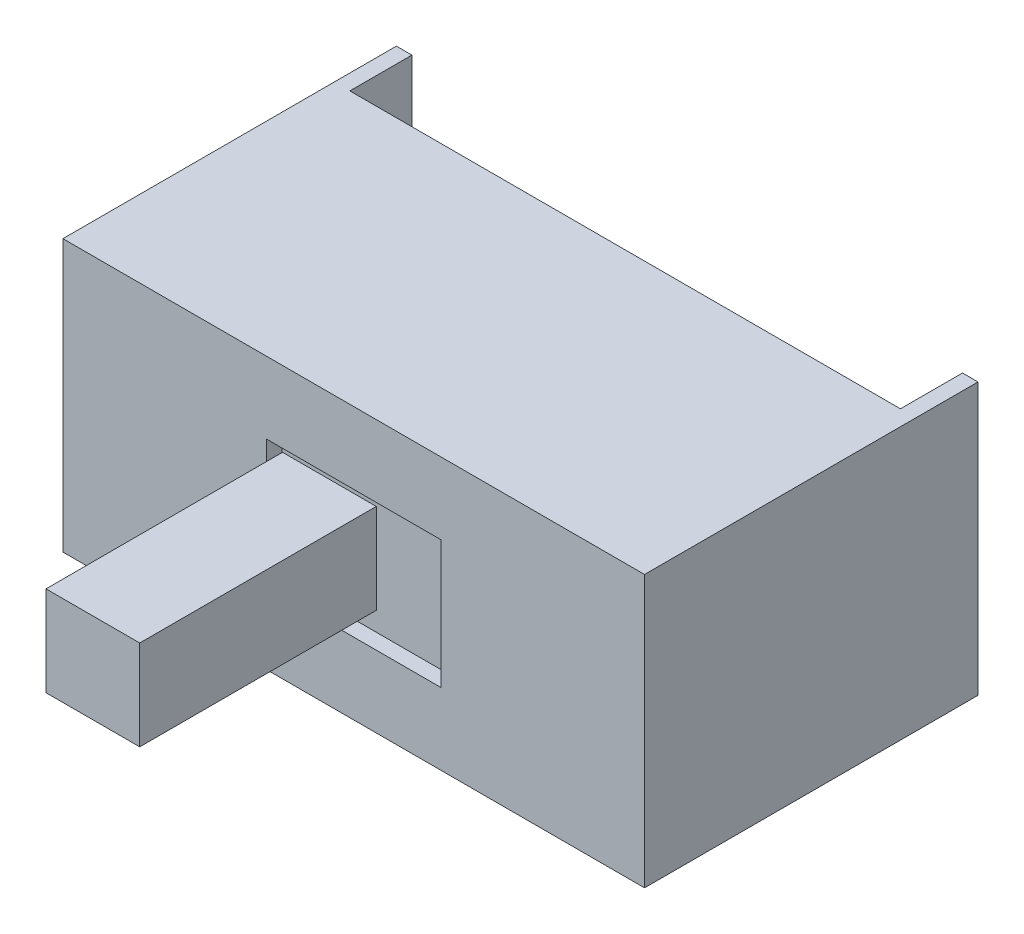
ISO-10303-21;
HEADER;
FILE_DESCRIPTION(('STEP AP214'),'2;1');
FILE_NAME('part.step','',(''),(''),'','','');
FILE_SCHEMA(('AUTOMOTIVE_DESIGN { 1 0 10303 214 1 1 1 1 }'));
ENDSEC;
DATA;
#1=APPLICATION_CONTEXT('core data for automotive mechanical design processes');
#2=APPLICATION_PROTOCOL_DEFINITION('international standard','automotive_design',2000,#1);
#3=PRODUCT_CONTEXT('',#1,'mechanical');
#4=PRODUCT('Part','Part','',(#3));
#5=PRODUCT_RELATED_PRODUCT_CATEGORY('part','',(#4));
#6=PRODUCT_DEFINITION_FORMATION('','',#4);
#7=PRODUCT_DEFINITION_CONTEXT('part definition',#1,'design');
#8=PRODUCT_DEFINITION('design','',#6,#7);
#9=PRODUCT_DEFINITION_SHAPE('','',#8);
#10=(LENGTH_UNIT() NAMED_UNIT(*) SI_UNIT(.MILLI.,.METRE.));
#11=(NAMED_UNIT(*) PLANE_ANGLE_UNIT() SI_UNIT($,.RADIAN.));
#12=(NAMED_UNIT(*) SI_UNIT($,.STERADIAN.) SOLID_ANGLE_UNIT());
#13=UNCERTAINTY_MEASURE_WITH_UNIT(LENGTH_MEASURE(1.E-05),#10,'distance_accuracy_value','');
#14=(GEOMETRIC_REPRESENTATION_CONTEXT(3) GLOBAL_UNCERTAINTY_ASSIGNED_CONTEXT((#13)) GLOBAL_UNIT_ASSIGNED_CONTEXT((#10,
#11,#12)) REPRESENTATION_CONTEXT('',''));
#15=CARTESIAN_POINT('',(0.,0.,0.));
#16=DIRECTION('',(0.,0.,1.));
#17=DIRECTION('',(1.,0.,0.));
#18=AXIS2_PLACEMENT_3D('',#15,#16,#17);
#19=CARTESIAN_POINT('',(0.,0.,0.));
#20=DIRECTION('',(0.,0.,-1.));
#21=DIRECTION('',(-1.,0.,0.));
#22=AXIS2_PLACEMENT_3D('',#19,#20,#21);
#23=PLANE('',#22);
#24=DIRECTION('',(0.,-1.,0.));
#25=VECTOR('',#24,1.);
#26=CARTESIAN_POINT('',(5.25,5.15,0.));
#27=LINE('',#26,#25);
#28=CARTESIAN_POINT('',(5.25,5.15,0.));
#29=VERTEX_POINT('',#28);
#30=CARTESIAN_POINT('',(5.25,1.85,0.));
#31=VERTEX_POINT('',#30);
#32=EDGE_CURVE('E238',#29,#31,#27,.T.);
#33=ORIENTED_EDGE('',*,*,#32,.T.);
#34=DIRECTION('',(1.,0.,0.));
#35=VECTOR('',#34,1.);
#36=CARTESIAN_POINT('',(9.75,1.85,0.));
#37=LINE('',#36,#35);
#38=CARTESIAN_POINT('',(9.75,1.85,0.));
#39=VERTEX_POINT('',#38);
#40=EDGE_CURVE('E222',#31,#39,#37,.T.);
#41=ORIENTED_EDGE('',*,*,#40,.T.);
#42=DIRECTION('',(0.,1.,0.));
#43=VECTOR('',#42,1.);
#44=CARTESIAN_POINT('',(9.75,5.15,0.));
#45=LINE('',#44,#43);
#46=CARTESIAN_POINT('',(9.75,5.15,0.));
#47=VERTEX_POINT('',#46);
#48=EDGE_CURVE('E224',#39,#47,#45,.T.);
#49=ORIENTED_EDGE('',*,*,#48,.T.);
#50=DIRECTION('',(-1.,0.,0.));
#51=VECTOR('',#50,1.);
#52=CARTESIAN_POINT('',(9.75,5.15,0.));
#53=LINE('',#52,#51);
#54=EDGE_CURVE('E232',#47,#29,#53,.T.);
#55=ORIENTED_EDGE('',*,*,#54,.T.);
#56=EDGE_LOOP('',(#33,#41,#49,#55));
#57=FACE_BOUND('',#56,.T.);
#58=DIRECTION('',(0.,-1.,0.));
#59=VECTOR('',#58,1.);
#60=CARTESIAN_POINT('',(5.26381954600787,4.66018641608083,0.));
#61=LINE('',#60,#59);
#62=CARTESIAN_POINT('',(5.26381954600787,4.66018641608083,0.));
#63=VERTEX_POINT('',#62);
#64=CARTESIAN_POINT('',(5.26381954600787,2.33981358391917,0.));
#65=VERTEX_POINT('',#64);
#66=EDGE_CURVE('E180',#63,#65,#61,.T.);
#67=ORIENTED_EDGE('',*,*,#66,.F.);
#68=DIRECTION('',(-1.,0.,0.));
#69=VECTOR('',#68,1.);
#70=CARTESIAN_POINT('',(5.26381954600787,4.66018641608083,0.));
#71=LINE('',#70,#69);
#72=CARTESIAN_POINT('',(7.68116664972376,4.66018641608083,0.));
#73=VERTEX_POINT('',#72);
#74=EDGE_CURVE('E172',#73,#63,#71,.T.);
#75=ORIENTED_EDGE('',*,*,#74,.F.);
#76=DIRECTION('',(0.,1.,0.));
#77=VECTOR('',#76,1.);
#78=CARTESIAN_POINT('',(7.68116664972376,4.66018641608083,0.));
#79=LINE('',#78,#77);
#80=CARTESIAN_POINT('',(7.68116664972376,2.33981358391917,0.));
#81=VERTEX_POINT('',#80);
#82=EDGE_CURVE('E63',#81,#73,#79,.T.);
#83=ORIENTED_EDGE('',*,*,#82,.F.);
#84=DIRECTION('',(1.,0.,0.));
#85=VECTOR('',#84,1.);
#86=CARTESIAN_POINT('',(5.26381954600787,2.33981358391917,0.));
#87=LINE('',#86,#85);
#88=EDGE_CURVE('E58',#65,#81,#87,.T.);
#89=ORIENTED_EDGE('',*,*,#88,.F.);
#90=EDGE_LOOP('',(#67,#75,#83,#89));
#91=FACE_BOUND('',#90,.T.);
#92=ADVANCED_FACE('F44',(#57,#91),#23,.F.);
#93=CARTESIAN_POINT('',(0.,0.,-6.6));
#94=DIRECTION('',(0.,0.,-1.));
#95=DIRECTION('',(-1.,0.,0.));
#96=AXIS2_PLACEMENT_3D('',#93,#94,#95);
#97=PLANE('',#96);
#98=DIRECTION('',(-1.,0.,0.));
#99=VECTOR('',#98,1.);
#100=CARTESIAN_POINT('',(15.,0.,-6.6));
#101=LINE('',#100,#99);
#102=CARTESIAN_POINT('',(14.6,0.,-6.6));
#103=VERTEX_POINT('',#102);
#104=CARTESIAN_POINT('',(0.399999999999999,0.,-6.6));
#105=VERTEX_POINT('',#104);
#106=EDGE_CURVE('E213',#103,#105,#101,.T.);
#107=ORIENTED_EDGE('',*,*,#106,.T.);
#108=DIRECTION('',(0.,1.,0.));
#109=VECTOR('',#108,1.);
#110=CARTESIAN_POINT('',(0.4,0.,-6.6));
#111=LINE('',#110,#109);
#112=CARTESIAN_POINT('',(0.399999999999999,7.,-6.6));
#113=VERTEX_POINT('',#112);
#114=EDGE_CURVE('E196',#105,#113,#111,.T.);
#115=ORIENTED_EDGE('',*,*,#114,.T.);
#116=DIRECTION('',(1.,0.,0.));
#117=VECTOR('',#116,1.);
#118=CARTESIAN_POINT('',(15.,7.,-6.6));
#119=LINE('',#118,#117);
#120=CARTESIAN_POINT('',(14.6,7.,-6.6));
#121=VERTEX_POINT('',#120);
#122=EDGE_CURVE('E218',#113,#121,#119,.T.);
#123=ORIENTED_EDGE('',*,*,#122,.T.);
#124=DIRECTION('',(0.,-1.,0.));
#125=VECTOR('',#124,1.);
#126=CARTESIAN_POINT('',(14.6,0.,-6.6));
#127=LINE('',#126,#125);
#128=EDGE_CURVE('E11',#121,#103,#127,.T.);
#129=ORIENTED_EDGE('',*,*,#128,.T.);
#130=EDGE_LOOP('',(#107,#115,#123,#129));
#131=FACE_BOUND('',#130,.T.);
#132=ADVANCED_FACE('F307',(#131),#97,.T.);
#133=CARTESIAN_POINT('',(0.,0.,0.4));
#134=DIRECTION('',(0.,0.,-1.));
#135=DIRECTION('',(-1.,0.,0.));
#136=AXIS2_PLACEMENT_3D('',#133,#134,#135);
#137=PLANE('',#136);
#138=DIRECTION('',(1.,0.,0.));
#139=VECTOR('',#138,1.);
#140=CARTESIAN_POINT('',(0.,0.,0.4));
#141=LINE('',#140,#139);
#142=CARTESIAN_POINT('',(0.,0.,0.4));
#143=VERTEX_POINT('',#142);
#144=CARTESIAN_POINT('',(15.,0.,0.4));
#145=VERTEX_POINT('',#144);
#146=EDGE_CURVE('E257',#143,#145,#141,.T.);
#147=ORIENTED_EDGE('',*,*,#146,.T.);
#148=DIRECTION('',(0.,1.,0.));
#149=VECTOR('',#148,1.);
#150=CARTESIAN_POINT('',(15.,0.,0.4));
#151=LINE('',#150,#149);
#152=CARTESIAN_POINT('',(15.,7.,0.4));
#153=VERTEX_POINT('',#152);
#154=EDGE_CURVE('E259',#145,#153,#151,.T.);
#155=ORIENTED_EDGE('',*,*,#154,.T.);
#156=DIRECTION('',(-1.,0.,0.));
#157=VECTOR('',#156,1.);
#158=CARTESIAN_POINT('',(0.,7.,0.4));
#159=LINE('',#158,#157);
#160=CARTESIAN_POINT('',(0.,7.,0.4));
#161=VERTEX_POINT('',#160);
#162=EDGE_CURVE('E258',#153,#161,#159,.T.);
#163=ORIENTED_EDGE('',*,*,#162,.T.);
#164=DIRECTION('',(0.,-1.,0.));
#165=VECTOR('',#164,1.);
#166=CARTESIAN_POINT('',(0.,0.,0.4));
#167=LINE('',#166,#165);
#168=EDGE_CURVE('E254',#161,#143,#167,.T.);
#169=ORIENTED_EDGE('',*,*,#168,.T.);
#170=EDGE_LOOP('',(#147,#155,#163,#169));
#171=FACE_BOUND('',#170,.T.);
#172=DIRECTION('',(0.,1.,0.));
#173=VECTOR('',#172,1.);
#174=CARTESIAN_POINT('',(9.75,5.15,0.4));
#175=LINE('',#174,#173);
#176=CARTESIAN_POINT('',(9.75,1.85,0.4));
#177=VERTEX_POINT('',#176);
#178=CARTESIAN_POINT('',(9.75,5.15,0.4));
#179=VERTEX_POINT('',#178);
#180=EDGE_CURVE('E221',#177,#179,#175,.T.);
#181=ORIENTED_EDGE('',*,*,#180,.F.);
#182=DIRECTION('',(1.,0.,0.));
#183=VECTOR('',#182,1.);
#184=CARTESIAN_POINT('',(9.75,1.85,0.4));
#185=LINE('',#184,#183);
#186=CARTESIAN_POINT('',(5.25,1.85,0.4));
#187=VERTEX_POINT('',#186);
#188=EDGE_CURVE('E229',#187,#177,#185,.T.);
#189=ORIENTED_EDGE('',*,*,#188,.F.);
#190=DIRECTION('',(0.,-1.,0.));
#191=VECTOR('',#190,1.);
#192=CARTESIAN_POINT('',(5.25,5.15,0.4));
#193=LINE('',#192,#191);
#194=CARTESIAN_POINT('',(5.25,5.15,0.4));
#195=VERTEX_POINT('',#194);
#196=EDGE_CURVE('E227',#195,#187,#193,.T.);
#197=ORIENTED_EDGE('',*,*,#196,.F.);
#198=DIRECTION('',(-1.,0.,0.));
#199=VECTOR('',#198,1.);
#200=CARTESIAN_POINT('',(9.75,5.15,0.4));
#201=LINE('',#200,#199);
#202=EDGE_CURVE('E223',#179,#195,#201,.T.);
#203=ORIENTED_EDGE('',*,*,#202,.F.);
#204=EDGE_LOOP('',(#181,#189,#197,#203));
#205=FACE_BOUND('',#204,.T.);
#206=ADVANCED_FACE('F310',(#171,#205),#137,.F.);
#207=CARTESIAN_POINT('',(0.,0.,0.4));
#208=DIRECTION('',(1.,0.,0.));
#209=DIRECTION('',(0.,0.,-1.));
#210=AXIS2_PLACEMENT_3D('',#207,#208,#209);
#211=PLANE('',#210);
#212=DIRECTION('',(0.,0.,-1.));
#213=VECTOR('',#212,1.);
#214=CARTESIAN_POINT('',(0.,7.,0.4));
#215=LINE('',#214,#213);
#216=CARTESIAN_POINT('',(0.,7.,-8.2));
#217=VERTEX_POINT('',#216);
#218=EDGE_CURVE('E261',#161,#217,#215,.T.);
#219=ORIENTED_EDGE('',*,*,#218,.T.);
#220=DIRECTION('',(0.,-1.,0.));
#221=VECTOR('',#220,1.);
#222=CARTESIAN_POINT('',(0.,7.,-8.2));
#223=LINE('',#222,#221);
#224=CARTESIAN_POINT('',(0.,0.,-8.2));
#225=VERTEX_POINT('',#224);
#226=EDGE_CURVE('E178',#217,#225,#223,.T.);
#227=ORIENTED_EDGE('',*,*,#226,.T.);
#228=DIRECTION('',(0.,0.,-1.));
#229=VECTOR('',#228,1.);
#230=CARTESIAN_POINT('',(0.,0.,0.4));
#231=LINE('',#230,#229);
#232=EDGE_CURVE('E52',#143,#225,#231,.T.);
#233=ORIENTED_EDGE('',*,*,#232,.F.);
#234=ORIENTED_EDGE('',*,*,#168,.F.);
#235=EDGE_LOOP('',(#219,#227,#233,#234));
#236=FACE_BOUND('',#235,.T.);
#237=ADVANCED_FACE('F50',(#236),#211,.F.);
#238=CARTESIAN_POINT('',(0.,0.,0.4));
#239=DIRECTION('',(0.,1.,0.));
#240=DIRECTION('',(0.,0.,1.));
#241=AXIS2_PLACEMENT_3D('',#238,#239,#240);
#242=PLANE('',#241);
#243=ORIENTED_EDGE('',*,*,#232,.T.);
#244=DIRECTION('',(-1.,0.,0.));
#245=VECTOR('',#244,1.);
#246=CARTESIAN_POINT('',(0.4,0.,-8.2));
#247=LINE('',#246,#245);
#248=CARTESIAN_POINT('',(0.4,0.,-8.2));
#249=VERTEX_POINT('',#248);
#250=EDGE_CURVE('E191',#249,#225,#247,.T.);
#251=ORIENTED_EDGE('',*,*,#250,.F.);
#252=DIRECTION('',(0.,0.,-1.));
#253=VECTOR('',#252,1.);
#254=CARTESIAN_POINT('',(0.4,0.,0.4));
#255=LINE('',#254,#253);
#256=EDGE_CURVE('E192',#105,#249,#255,.T.);
#257=ORIENTED_EDGE('',*,*,#256,.F.);
#258=ORIENTED_EDGE('',*,*,#106,.F.);
#259=DIRECTION('',(0.,0.,-1.));
#260=VECTOR('',#259,1.);
#261=CARTESIAN_POINT('',(14.6,0.,0.4));
#262=LINE('',#261,#260);
#263=CARTESIAN_POINT('',(14.6,0.,-8.2));
#264=VERTEX_POINT('',#263);
#265=EDGE_CURVE('E201',#103,#264,#262,.T.);
#266=ORIENTED_EDGE('',*,*,#265,.T.);
#267=DIRECTION('',(1.,0.,0.));
#268=VECTOR('',#267,1.);
#269=CARTESIAN_POINT('',(14.6,0.,-8.2));
#270=LINE('',#269,#268);
#271=CARTESIAN_POINT('',(15.,0.,-8.2));
#272=VERTEX_POINT('',#271);
#273=EDGE_CURVE('E209',#264,#272,#270,.T.);
#274=ORIENTED_EDGE('',*,*,#273,.T.);
#275=DIRECTION('',(0.,0.,-1.));
#276=VECTOR('',#275,1.);
#277=CARTESIAN_POINT('',(15.,0.,0.4));
#278=LINE('',#277,#276);
#279=EDGE_CURVE('E269',#145,#272,#278,.T.);
#280=ORIENTED_EDGE('',*,*,#279,.F.);
#281=ORIENTED_EDGE('',*,*,#146,.F.);
#282=EDGE_LOOP('',(#243,#251,#257,#258,#266,#274,#280,#281));
#283=FACE_BOUND('',#282,.T.);
#284=ADVANCED_FACE('F267',(#283),#242,.F.);
#285=CARTESIAN_POINT('',(15.,0.,0.4));
#286=DIRECTION('',(-1.,0.,0.));
#287=DIRECTION('',(0.,0.,1.));
#288=AXIS2_PLACEMENT_3D('',#285,#286,#287);
#289=PLANE('',#288);
#290=ORIENTED_EDGE('',*,*,#279,.T.);
#291=DIRECTION('',(0.,-1.,0.));
#292=VECTOR('',#291,1.);
#293=CARTESIAN_POINT('',(15.,7.,-8.2));
#294=LINE('',#293,#292);
#295=CARTESIAN_POINT('',(15.,7.,-8.2));
#296=VERTEX_POINT('',#295);
#297=EDGE_CURVE('E204',#296,#272,#294,.T.);
#298=ORIENTED_EDGE('',*,*,#297,.F.);
#299=DIRECTION('',(0.,0.,-1.));
#300=VECTOR('',#299,1.);
#301=CARTESIAN_POINT('',(15.,7.,0.4));
#302=LINE('',#301,#300);
#303=EDGE_CURVE('E263',#153,#296,#302,.T.);
#304=ORIENTED_EDGE('',*,*,#303,.F.);
#305=ORIENTED_EDGE('',*,*,#154,.F.);
#306=EDGE_LOOP('',(#290,#298,#304,#305));
#307=FACE_BOUND('',#306,.T.);
#308=ADVANCED_FACE('F304',(#307),#289,.F.);
#309=CARTESIAN_POINT('',(0.,7.,0.4));
#310=DIRECTION('',(0.,-1.,0.));
#311=DIRECTION('',(0.,0.,-1.));
#312=AXIS2_PLACEMENT_3D('',#309,#310,#311);
#313=PLANE('',#312);
#314=ORIENTED_EDGE('',*,*,#218,.F.);
#315=ORIENTED_EDGE('',*,*,#162,.F.);
#316=ORIENTED_EDGE('',*,*,#303,.T.);
#317=DIRECTION('',(1.,0.,0.));
#318=VECTOR('',#317,1.);
#319=CARTESIAN_POINT('',(14.6,7.,-8.2));
#320=LINE('',#319,#318);
#321=CARTESIAN_POINT('',(14.6,7.,-8.2));
#322=VERTEX_POINT('',#321);
#323=EDGE_CURVE('E215',#322,#296,#320,.T.);
#324=ORIENTED_EDGE('',*,*,#323,.F.);
#325=DIRECTION('',(0.,0.,-1.));
#326=VECTOR('',#325,1.);
#327=CARTESIAN_POINT('',(14.6,7.,0.4));
#328=LINE('',#327,#326);
#329=EDGE_CURVE('E210',#121,#322,#328,.T.);
#330=ORIENTED_EDGE('',*,*,#329,.F.);
#331=ORIENTED_EDGE('',*,*,#122,.F.);
#332=DIRECTION('',(0.,0.,-1.));
#333=VECTOR('',#332,1.);
#334=CARTESIAN_POINT('',(0.4,7.,0.4));
#335=LINE('',#334,#333);
#336=CARTESIAN_POINT('',(0.4,7.,-8.2));
#337=VERTEX_POINT('',#336);
#338=EDGE_CURVE('E181',#113,#337,#335,.T.);
#339=ORIENTED_EDGE('',*,*,#338,.T.);
#340=DIRECTION('',(-1.,0.,0.));
#341=VECTOR('',#340,1.);
#342=CARTESIAN_POINT('',(0.4,7.,-8.2));
#343=LINE('',#342,#341);
#344=EDGE_CURVE('E195',#337,#217,#343,.T.);
#345=ORIENTED_EDGE('',*,*,#344,.T.);
#346=EDGE_LOOP('',(#314,#315,#316,#324,#330,#331,#339,#345));
#347=FACE_BOUND('',#346,.T.);
#348=ADVANCED_FACE('F285',(#347),#313,.F.);
#349=CARTESIAN_POINT('',(9.75,5.15,0.4));
#350=DIRECTION('',(-1.,0.,0.));
#351=DIRECTION('',(0.,-1.,0.));
#352=AXIS2_PLACEMENT_3D('',#349,#350,#351);
#353=PLANE('',#352);
#354=ORIENTED_EDGE('',*,*,#48,.F.);
#355=DIRECTION('',(0.,0.,-1.));
#356=VECTOR('',#355,1.);
#357=CARTESIAN_POINT('',(9.75,1.85,0.4));
#358=LINE('',#357,#356);
#359=EDGE_CURVE('E235',#177,#39,#358,.T.);
#360=ORIENTED_EDGE('',*,*,#359,.F.);
#361=ORIENTED_EDGE('',*,*,#180,.T.);
#362=DIRECTION('',(0.,0.,-1.));
#363=VECTOR('',#362,1.);
#364=CARTESIAN_POINT('',(9.75,5.15,0.4));
#365=LINE('',#364,#363);
#366=EDGE_CURVE('E249',#179,#47,#365,.T.);
#367=ORIENTED_EDGE('',*,*,#366,.T.);
#368=EDGE_LOOP('',(#354,#360,#361,#367));
#369=FACE_BOUND('',#368,.T.);
#370=ADVANCED_FACE('F333',(#369),#353,.T.);
#371=CARTESIAN_POINT('',(9.75,5.15,0.4));
#372=DIRECTION('',(0.,-1.,0.));
#373=DIRECTION('',(1.,0.,0.));
#374=AXIS2_PLACEMENT_3D('',#371,#372,#373);
#375=PLANE('',#374);
#376=ORIENTED_EDGE('',*,*,#54,.F.);
#377=ORIENTED_EDGE('',*,*,#366,.F.);
#378=ORIENTED_EDGE('',*,*,#202,.T.);
#379=DIRECTION('',(0.,0.,-1.));
#380=VECTOR('',#379,1.);
#381=CARTESIAN_POINT('',(5.25,5.15,0.4));
#382=LINE('',#381,#380);
#383=EDGE_CURVE('E247',#195,#29,#382,.T.);
#384=ORIENTED_EDGE('',*,*,#383,.T.);
#385=EDGE_LOOP('',(#376,#377,#378,#384));
#386=FACE_BOUND('',#385,.T.);
#387=ADVANCED_FACE('F327',(#386),#375,.T.);
#388=CARTESIAN_POINT('',(5.25,5.15,0.4));
#389=DIRECTION('',(1.,0.,0.));
#390=DIRECTION('',(0.,0.,-1.));
#391=AXIS2_PLACEMENT_3D('',#388,#389,#390);
#392=PLANE('',#391);
#393=ORIENTED_EDGE('',*,*,#32,.F.);
#394=ORIENTED_EDGE('',*,*,#383,.F.);
#395=ORIENTED_EDGE('',*,*,#196,.T.);
#396=DIRECTION('',(0.,0.,-1.));
#397=VECTOR('',#396,1.);
#398=CARTESIAN_POINT('',(5.25,1.85,0.4));
#399=LINE('',#398,#397);
#400=EDGE_CURVE('E244',#187,#31,#399,.T.);
#401=ORIENTED_EDGE('',*,*,#400,.T.);
#402=EDGE_LOOP('',(#393,#394,#395,#401));
#403=FACE_BOUND('',#402,.T.);
#404=ADVANCED_FACE('F329',(#403),#392,.T.);
#405=CARTESIAN_POINT('',(9.75,1.85,0.4));
#406=DIRECTION('',(0.,1.,0.));
#407=DIRECTION('',(-1.,0.,0.));
#408=AXIS2_PLACEMENT_3D('',#405,#406,#407);
#409=PLANE('',#408);
#410=ORIENTED_EDGE('',*,*,#40,.F.);
#411=ORIENTED_EDGE('',*,*,#400,.F.);
#412=ORIENTED_EDGE('',*,*,#188,.T.);
#413=ORIENTED_EDGE('',*,*,#359,.T.);
#414=EDGE_LOOP('',(#410,#411,#412,#413));
#415=FACE_BOUND('',#414,.T.);
#416=ADVANCED_FACE('F324',(#415),#409,.T.);
#417=CARTESIAN_POINT('',(14.6,7.,-8.2));
#418=DIRECTION('',(0.,0.,1.));
#419=DIRECTION('',(0.,-1.,0.));
#420=AXIS2_PLACEMENT_3D('',#417,#418,#419);
#421=PLANE('',#420);
#422=ORIENTED_EDGE('',*,*,#297,.T.);
#423=ORIENTED_EDGE('',*,*,#273,.F.);
#424=DIRECTION('',(0.,-1.,0.));
#425=VECTOR('',#424,1.);
#426=CARTESIAN_POINT('',(14.6,7.,-8.2));
#427=LINE('',#426,#425);
#428=EDGE_CURVE('E203',#322,#264,#427,.T.);
#429=ORIENTED_EDGE('',*,*,#428,.F.);
#430=ORIENTED_EDGE('',*,*,#323,.T.);
#431=EDGE_LOOP('',(#422,#423,#429,#430));
#432=FACE_BOUND('',#431,.T.);
#433=ADVANCED_FACE('F297',(#432),#421,.F.);
#434=CARTESIAN_POINT('',(14.6,0.,0.));
#435=DIRECTION('',(1.,0.,0.));
#436=DIRECTION('',(0.,0.,-1.));
#437=AXIS2_PLACEMENT_3D('',#434,#435,#436);
#438=PLANE('',#437);
#439=ORIENTED_EDGE('',*,*,#128,.F.);
#440=ORIENTED_EDGE('',*,*,#329,.T.);
#441=ORIENTED_EDGE('',*,*,#428,.T.);
#442=ORIENTED_EDGE('',*,*,#265,.F.);
#443=EDGE_LOOP('',(#439,#440,#441,#442));
#444=FACE_BOUND('',#443,.T.);
#445=ADVANCED_FACE('F295',(#444),#438,.F.);
#446=CARTESIAN_POINT('',(0.4,7.,-8.2));
#447=DIRECTION('',(0.,0.,-1.));
#448=DIRECTION('',(0.,1.,0.));
#449=AXIS2_PLACEMENT_3D('',#446,#447,#448);
#450=PLANE('',#449);
#451=ORIENTED_EDGE('',*,*,#226,.F.);
#452=ORIENTED_EDGE('',*,*,#344,.F.);
#453=DIRECTION('',(0.,-1.,0.));
#454=VECTOR('',#453,1.);
#455=CARTESIAN_POINT('',(0.4,7.,-8.2));
#456=LINE('',#455,#454);
#457=EDGE_CURVE('E189',#337,#249,#456,.T.);
#458=ORIENTED_EDGE('',*,*,#457,.T.);
#459=ORIENTED_EDGE('',*,*,#250,.T.);
#460=EDGE_LOOP('',(#451,#452,#458,#459));
#461=FACE_BOUND('',#460,.T.);
#462=ADVANCED_FACE('F280',(#461),#450,.T.);
#463=CARTESIAN_POINT('',(0.4,0.,0.));
#464=DIRECTION('',(-1.,0.,0.));
#465=DIRECTION('',(0.,0.,1.));
#466=AXIS2_PLACEMENT_3D('',#463,#464,#465);
#467=PLANE('',#466);
#468=ORIENTED_EDGE('',*,*,#114,.F.);
#469=ORIENTED_EDGE('',*,*,#256,.T.);
#470=ORIENTED_EDGE('',*,*,#457,.F.);
#471=ORIENTED_EDGE('',*,*,#338,.F.);
#472=EDGE_LOOP('',(#468,#469,#470,#471));
#473=FACE_BOUND('',#472,.T.);
#474=ADVANCED_FACE('F290',(#473),#467,.F.);
#475=CARTESIAN_POINT('',(5.26381954600787,4.66018641608083,6.1));
#476=DIRECTION('',(1.,0.,0.));
#477=DIRECTION('',(0.,0.,-1.));
#478=AXIS2_PLACEMENT_3D('',#475,#476,#477);
#479=PLANE('',#478);
#480=ORIENTED_EDGE('',*,*,#66,.T.);
#481=DIRECTION('',(0.,0.,-1.));
#482=VECTOR('',#481,1.);
#483=CARTESIAN_POINT('',(5.26381954600787,2.33981358391917,6.1));
#484=LINE('',#483,#482);
#485=CARTESIAN_POINT('',(5.26381954600787,2.33981358391917,6.1));
#486=VERTEX_POINT('',#485);
#487=EDGE_CURVE('E160',#486,#65,#484,.T.);
#488=ORIENTED_EDGE('',*,*,#487,.F.);
#489=DIRECTION('',(0.,-1.,0.));
#490=VECTOR('',#489,1.);
#491=CARTESIAN_POINT('',(5.26381954600787,4.66018641608083,6.1));
#492=LINE('',#491,#490);
#493=CARTESIAN_POINT('',(5.26381954600787,4.66018641608083,6.1));
#494=VERTEX_POINT('',#493);
#495=EDGE_CURVE('E164',#494,#486,#492,.T.);
#496=ORIENTED_EDGE('',*,*,#495,.F.);
#497=DIRECTION('',(0.,0.,-1.));
#498=VECTOR('',#497,1.);
#499=CARTESIAN_POINT('',(5.26381954600787,4.66018641608083,6.1));
#500=LINE('',#499,#498);
#501=EDGE_CURVE('E504',#494,#63,#500,.T.);
#502=ORIENTED_EDGE('',*,*,#501,.T.);
#503=EDGE_LOOP('',(#480,#488,#496,#502));
#504=FACE_BOUND('',#503,.T.);
#505=ADVANCED_FACE('F176',(#504),#479,.F.);
#506=CARTESIAN_POINT('',(5.26381954600787,2.33981358391917,6.1));
#507=DIRECTION('',(0.,1.,0.));
#508=DIRECTION('',(0.,0.,1.));
#509=AXIS2_PLACEMENT_3D('',#506,#507,#508);
#510=PLANE('',#509);
#511=ORIENTED_EDGE('',*,*,#88,.T.);
#512=DIRECTION('',(0.,0.,-1.));
#513=VECTOR('',#512,1.);
#514=CARTESIAN_POINT('',(7.68116664972376,2.33981358391917,6.1));
#515=LINE('',#514,#513);
#516=CARTESIAN_POINT('',(7.68116664972376,2.33981358391917,6.1));
#517=VERTEX_POINT('',#516);
#518=EDGE_CURVE('E163',#517,#81,#515,.T.);
#519=ORIENTED_EDGE('',*,*,#518,.F.);
#520=DIRECTION('',(1.,0.,0.));
#521=VECTOR('',#520,1.);
#522=CARTESIAN_POINT('',(5.26381954600787,2.33981358391917,6.1));
#523=LINE('',#522,#521);
#524=EDGE_CURVE('E153',#486,#517,#523,.T.);
#525=ORIENTED_EDGE('',*,*,#524,.F.);
#526=ORIENTED_EDGE('',*,*,#487,.T.);
#527=EDGE_LOOP('',(#511,#519,#525,#526));
#528=FACE_BOUND('',#527,.T.);
#529=ADVANCED_FACE('F159',(#528),#510,.F.);
#530=CARTESIAN_POINT('',(7.68116664972376,4.66018641608083,6.1));
#531=DIRECTION('',(-1.,0.,0.));
#532=DIRECTION('',(0.,0.,1.));
#533=AXIS2_PLACEMENT_3D('',#530,#531,#532);
#534=PLANE('',#533);
#535=ORIENTED_EDGE('',*,*,#82,.T.);
#536=DIRECTION('',(0.,0.,-1.));
#537=VECTOR('',#536,1.);
#538=CARTESIAN_POINT('',(7.68116664972376,4.66018641608083,6.1));
#539=LINE('',#538,#537);
#540=CARTESIAN_POINT('',(7.68116664972376,4.66018641608083,6.1));
#541=VERTEX_POINT('',#540);
#542=EDGE_CURVE('E182',#541,#73,#539,.T.);
#543=ORIENTED_EDGE('',*,*,#542,.F.);
#544=DIRECTION('',(0.,1.,0.));
#545=VECTOR('',#544,1.);
#546=CARTESIAN_POINT('',(7.68116664972376,4.66018641608083,6.1));
#547=LINE('',#546,#545);
#548=EDGE_CURVE('E165',#517,#541,#547,.T.);
#549=ORIENTED_EDGE('',*,*,#548,.F.);
#550=ORIENTED_EDGE('',*,*,#518,.T.);
#551=EDGE_LOOP('',(#535,#543,#549,#550));
#552=FACE_BOUND('',#551,.T.);
#553=ADVANCED_FACE('F460',(#552),#534,.F.);
#554=CARTESIAN_POINT('',(5.26381954600787,4.66018641608083,6.1));
#555=DIRECTION('',(0.,-1.,0.));
#556=DIRECTION('',(0.,0.,-1.));
#557=AXIS2_PLACEMENT_3D('',#554,#555,#556);
#558=PLANE('',#557);
#559=ORIENTED_EDGE('',*,*,#74,.T.);
#560=ORIENTED_EDGE('',*,*,#501,.F.);
#561=DIRECTION('',(-1.,0.,0.));
#562=VECTOR('',#561,1.);
#563=CARTESIAN_POINT('',(5.26381954600787,4.66018641608083,6.1));
#564=LINE('',#563,#562);
#565=EDGE_CURVE('E167',#541,#494,#564,.T.);
#566=ORIENTED_EDGE('',*,*,#565,.F.);
#567=ORIENTED_EDGE('',*,*,#542,.T.);
#568=EDGE_LOOP('',(#559,#560,#566,#567));
#569=FACE_BOUND('',#568,.T.);
#570=ADVANCED_FACE('F470',(#569),#558,.F.);
#571=CARTESIAN_POINT('',(0.,0.,6.1));
#572=DIRECTION('',(0.,0.,1.));
#573=DIRECTION('',(1.,0.,0.));
#574=AXIS2_PLACEMENT_3D('',#571,#572,#573);
#575=PLANE('',#574);
#576=ORIENTED_EDGE('',*,*,#495,.T.);
#577=ORIENTED_EDGE('',*,*,#524,.T.);
#578=ORIENTED_EDGE('',*,*,#548,.T.);
#579=ORIENTED_EDGE('',*,*,#565,.T.);
#580=EDGE_LOOP('',(#576,#577,#578,#579));
#581=FACE_BOUND('',#580,.T.);
#582=ADVANCED_FACE('F166',(#581),#575,.T.);
#583=CLOSED_SHELL('',(#92,#132,#206,#237,#284,#308,#348,#370,#387,#404,#416,#433,#445,#462,#474,
#505,#529,#553,#570,#582));
#584=MANIFOLD_SOLID_BREP('B2',#583);
#585=ADVANCED_BREP_SHAPE_REPRESENTATION('',(#18,#584),#14);
#586=SHAPE_DEFINITION_REPRESENTATION(#9,#585);
ENDSEC;
END-ISO-10303-21;
